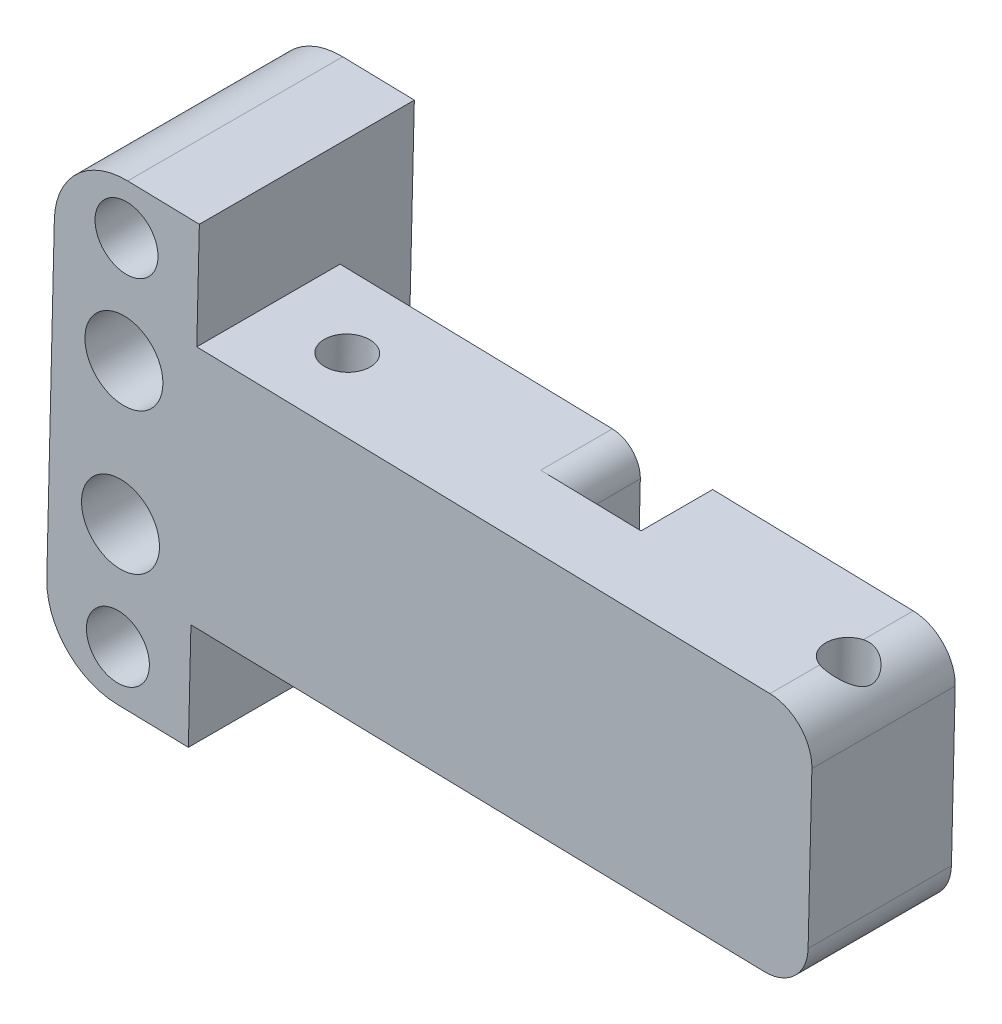
ISO-10303-21;
HEADER;
FILE_DESCRIPTION(('STEP AP214'),'2;1');
FILE_NAME('part.step','',(''),(''),'','','');
FILE_SCHEMA(('AUTOMOTIVE_DESIGN { 1 0 10303 214 1 1 1 1 }'));
ENDSEC;
DATA;
#1=APPLICATION_CONTEXT('core data for automotive mechanical design processes');
#2=APPLICATION_PROTOCOL_DEFINITION('international standard','automotive_design',2000,#1);
#3=PRODUCT_CONTEXT('',#1,'mechanical');
#4=PRODUCT('Part','Part','',(#3));
#5=PRODUCT_RELATED_PRODUCT_CATEGORY('part','',(#4));
#6=PRODUCT_DEFINITION_FORMATION('','',#4);
#7=PRODUCT_DEFINITION_CONTEXT('part definition',#1,'design');
#8=PRODUCT_DEFINITION('design','',#6,#7);
#9=PRODUCT_DEFINITION_SHAPE('','',#8);
#10=(LENGTH_UNIT() NAMED_UNIT(*) SI_UNIT(.MILLI.,.METRE.));
#11=(NAMED_UNIT(*) PLANE_ANGLE_UNIT() SI_UNIT($,.RADIAN.));
#12=(NAMED_UNIT(*) SI_UNIT($,.STERADIAN.) SOLID_ANGLE_UNIT());
#13=UNCERTAINTY_MEASURE_WITH_UNIT(LENGTH_MEASURE(1.E-05),#10,'distance_accuracy_value','');
#14=(GEOMETRIC_REPRESENTATION_CONTEXT(3) GLOBAL_UNCERTAINTY_ASSIGNED_CONTEXT((#13)) GLOBAL_UNIT_ASSIGNED_CONTEXT((#10,
#11,#12)) REPRESENTATION_CONTEXT('',''));
#15=CARTESIAN_POINT('',(0.,0.,0.));
#16=DIRECTION('',(0.,0.,1.));
#17=DIRECTION('',(1.,0.,0.));
#18=AXIS2_PLACEMENT_3D('',#15,#16,#17);
#19=CARTESIAN_POINT('',(0.,0.,-9.99999999999999));
#20=DIRECTION('',(0.,0.,-1.));
#21=DIRECTION('',(-1.,0.,0.));
#22=AXIS2_PLACEMENT_3D('',#19,#20,#21);
#23=PLANE('',#22);
#24=DIRECTION('',(-0.99971315620865,0.0239500585247725,0.));
#25=VECTOR('',#24,1.);
#26=CARTESIAN_POINT('',(22.5449846492901,8.02729576437194,-9.99999999999999));
#27=LINE('',#26,#25);
#28=CARTESIAN_POINT('',(26.5438372741246,7.93149553027285,-9.99999999999999));
#29=VERTEX_POINT('',#28);
#30=CARTESIAN_POINT('',(12.5478530872036,8.26679634961967,-9.99999999999999));
#31=VERTEX_POINT('',#30);
#32=EDGE_CURVE('E181',#29,#31,#27,.T.);
#33=ORIENTED_EDGE('',*,*,#32,.F.);
#34=CARTESIAN_POINT('',(26.4719870985503,4.93235606164691,-9.99999999999999));
#35=DIRECTION('',(0.,0.,-1.));
#36=DIRECTION('',(-1.,0.,0.));
#37=AXIS2_PLACEMENT_3D('',#34,#35,#36);
#38=CIRCLE('',#37,3.);
#39=CARTESIAN_POINT('',(29.4711265671763,4.86050588607259,-9.99999999999999));
#40=VERTEX_POINT('',#39);
#41=EDGE_CURVE('E544',#29,#40,#38,.T.);
#42=ORIENTED_EDGE('',*,*,#41,.T.);
#43=DIRECTION('',(-0.0239500585247709,-0.99971315620865,0.));
#44=VECTOR('',#43,1.);
#45=CARTESIAN_POINT('',(29.8746657660126,21.7048674856626,-9.99999999999999));
#46=LINE('',#45,#44);
#47=CARTESIAN_POINT('',(29.2076759234038,-6.13633883222251,-9.99999999999999));
#48=VERTEX_POINT('',#47);
#49=EDGE_CURVE('E236',#40,#48,#46,.T.);
#50=ORIENTED_EDGE('',*,*,#49,.T.);
#51=CARTESIAN_POINT('',(26.2085364547778,-6.0644886566482,-9.99999999999999));
#52=DIRECTION('',(0.,0.,-1.));
#53=DIRECTION('',(-1.,0.,0.));
#54=AXIS2_PLACEMENT_3D('',#51,#52,#53);
#55=CIRCLE('',#54,3.);
#56=CARTESIAN_POINT('',(26.1366862792035,-9.06362812527415,-9.99999999999999));
#57=VERTEX_POINT('',#56);
#58=EDGE_CURVE('E57',#48,#57,#55,.T.);
#59=ORIENTED_EDGE('',*,*,#58,.T.);
#60=DIRECTION('',(0.99971315620865,-0.0239500585247709,0.));
#61=VECTOR('',#60,1.);
#62=CARTESIAN_POINT('',(-13.8518399691425,-8.10562578428331,-9.99999999999999));
#63=LINE('',#62,#61);
#64=CARTESIAN_POINT('',(12.1407020922824,-8.72832730592735,-9.99999999999999));
#65=VERTEX_POINT('',#64);
#66=EDGE_CURVE('E192',#65,#57,#63,.T.);
#67=ORIENTED_EDGE('',*,*,#66,.F.);
#68=DIRECTION('',(-0.0239500585247725,-0.99971315620865,0.));
#69=VECTOR('',#68,1.);
#70=CARTESIAN_POINT('',(12.3427221080172,-0.295693734753971,-9.99999999999999));
#71=LINE('',#70,#69);
#72=EDGE_CURVE('E197',#31,#65,#71,.T.);
#73=ORIENTED_EDGE('',*,*,#72,.F.);
#74=EDGE_LOOP('',(#33,#42,#50,#59,#67,#73));
#75=FACE_BOUND('',#74,.T.);
#76=ADVANCED_FACE('F41',(#75),#23,.T.);
#77=CARTESIAN_POINT('',(-13.8518399691425,-8.10562578428331,-15.));
#78=DIRECTION('',(-0.0239500585247709,-0.99971315620865,0.));
#79=DIRECTION('',(0.99971315620865,-0.0239500585247709,0.));
#80=AXIS2_PLACEMENT_3D('',#77,#78,#79);
#81=PLANE('',#80);
#82=ORIENTED_EDGE('',*,*,#66,.T.);
#83=DIRECTION('',(0.,0.,1.));
#84=VECTOR('',#83,1.);
#85=CARTESIAN_POINT('',(26.1366862792035,-9.06362812527415,-15.));
#86=LINE('',#85,#84);
#87=CARTESIAN_POINT('',(26.1366862792035,-9.06362812527415,-6.51986841535685));
#88=VERTEX_POINT('',#87);
#89=EDGE_CURVE('E11',#57,#88,#86,.T.);
#90=ORIENTED_EDGE('',*,*,#89,.T.);
#91=CARTESIAN_POINT('',(26.6365428573079,-9.07560315453653,-4.99999999999979));
#92=DIRECTION('',(-0.0239500585247709,-0.99971315620865,0.));
#93=DIRECTION('',(0.99971315620865,-0.0239500585247709,0.));
#94=AXIS2_PLACEMENT_3D('',#91,#92,#93);
#95=CIRCLE('',#94,1.6);
#96=CARTESIAN_POINT('',(26.1366862792035,-9.06362812527415,-3.48013158464272));
#97=VERTEX_POINT('',#96);
#98=EDGE_CURVE('E237',#97,#88,#95,.T.);
#99=ORIENTED_EDGE('',*,*,#98,.F.);
#100=DIRECTION('',(0.,0.,1.));
#101=VECTOR('',#100,1.);
#102=CARTESIAN_POINT('',(26.1366862792035,-9.06362812527415,-15.));
#103=LINE('',#102,#101);
#104=CARTESIAN_POINT('',(26.1366862792035,-9.06362812527415,0.));
#105=VERTEX_POINT('',#104);
#106=EDGE_CURVE('E50',#97,#105,#103,.T.);
#107=ORIENTED_EDGE('',*,*,#106,.T.);
#108=DIRECTION('',(0.99971315620865,-0.0239500585247709,0.));
#109=VECTOR('',#108,1.);
#110=CARTESIAN_POINT('',(-13.8518399691425,-8.10562578428331,0.));
#111=LINE('',#110,#109);
#112=CARTESIAN_POINT('',(-13.8518399691425,-8.10562578428331,0.));
#113=VERTEX_POINT('',#112);
#114=EDGE_CURVE('E551',#113,#105,#111,.T.);
#115=ORIENTED_EDGE('',*,*,#114,.F.);
#116=DIRECTION('',(0.,0.,1.));
#117=VECTOR('',#116,1.);
#118=CARTESIAN_POINT('',(-13.8518399691425,-8.10562578428331,-15.));
#119=LINE('',#118,#117);
#120=CARTESIAN_POINT('',(-13.8518399691425,-8.10562578428331,-10.));
#121=VERTEX_POINT('',#120);
#122=EDGE_CURVE('E212',#121,#113,#119,.T.);
#123=ORIENTED_EDGE('',*,*,#122,.F.);
#124=CARTESIAN_POINT('',(5.14270999882189,-8.56067689625396,-9.99999999999999));
#125=VERTEX_POINT('',#124);
#126=EDGE_CURVE('E588',#121,#125,#63,.T.);
#127=ORIENTED_EDGE('',*,*,#126,.T.);
#128=DIRECTION('',(0.,0.,-1.));
#129=VECTOR('',#128,1.);
#130=CARTESIAN_POINT('',(5.14270999882189,-8.56067689625396,-5.));
#131=LINE('',#130,#129);
#132=CARTESIAN_POINT('',(5.14270999882189,-8.56067689625396,-5.));
#133=VERTEX_POINT('',#132);
#134=EDGE_CURVE('E222',#125,#133,#131,.F.);
#135=ORIENTED_EDGE('',*,*,#134,.T.);
#136=DIRECTION('',(-0.99971315620865,0.0239500585247709,0.));
#137=VECTOR('',#136,1.);
#138=CARTESIAN_POINT('',(-13.8518399691425,-8.10562578428331,-4.99999999999999));
#139=LINE('',#138,#137);
#140=CARTESIAN_POINT('',(12.1407020922824,-8.72832730592735,-5.));
#141=VERTEX_POINT('',#140);
#142=EDGE_CURVE('E580',#141,#133,#139,.T.);
#143=ORIENTED_EDGE('',*,*,#142,.F.);
#144=DIRECTION('',(0.,0.,1.));
#145=VECTOR('',#144,1.);
#146=CARTESIAN_POINT('',(12.1407020922824,-8.72832730592735,-15.));
#147=LINE('',#146,#145);
#148=EDGE_CURVE('E576',#65,#141,#147,.T.);
#149=ORIENTED_EDGE('',*,*,#148,.F.);
#150=EDGE_LOOP('',(#82,#90,#99,#107,#115,#123,#127,#135,#143,#149));
#151=FACE_BOUND('',#150,.T.);
#152=CARTESIAN_POINT('',(-8.35341760999489,-8.23735110616955,-4.99999999999979));
#153=DIRECTION('',(-0.0239500585247709,-0.99971315620865,0.));
#154=DIRECTION('',(0.99971315620865,-0.0239500585247709,0.));
#155=AXIS2_PLACEMENT_3D('',#152,#153,#154);
#156=CIRCLE('',#155,1.6);
#157=CARTESIAN_POINT('',(-6.75387656006104,-8.27567119980918,-4.99999999999979));
#158=VERTEX_POINT('',#157);
#159=EDGE_CURVE('E582',#158,#158,#156,.T.);
#160=ORIENTED_EDGE('',*,*,#159,.F.);
#161=EDGE_LOOP('',(#160));
#162=FACE_BOUND('',#161,.T.);
#163=ADVANCED_FACE('F317',(#151,#162),#81,.T.);
#164=CARTESIAN_POINT('',(22.5449846492901,8.02729576437194,-15.));
#165=DIRECTION('',(0.0239500585247724,0.99971315620865,0.));
#166=DIRECTION('',(-0.99971315620865,0.0239500585247725,0.));
#167=AXIS2_PLACEMENT_3D('',#164,#165,#166);
#168=PLANE('',#167);
#169=DIRECTION('',(-0.99971315620865,0.0239500585247724,0.));
#170=VECTOR('',#169,1.);
#171=CARTESIAN_POINT('',(22.5449846492901,8.02729576437194,0.));
#172=LINE('',#171,#170);
#173=CARTESIAN_POINT('',(26.5438372741246,7.93149553027285,0.));
#174=VERTEX_POINT('',#173);
#175=CARTESIAN_POINT('',(-13.4446889742213,8.88949787126375,0.));
#176=VERTEX_POINT('',#175);
#177=EDGE_CURVE('E613',#174,#176,#172,.T.);
#178=ORIENTED_EDGE('',*,*,#177,.F.);
#179=DIRECTION('',(0.,0.,1.));
#180=VECTOR('',#179,1.);
#181=CARTESIAN_POINT('',(26.5438372741246,7.93149553027285,-15.));
#182=LINE('',#181,#180);
#183=CARTESIAN_POINT('',(26.5438372741246,7.93149553027285,-3.48013158464272));
#184=VERTEX_POINT('',#183);
#185=EDGE_CURVE('E247',#174,#184,#182,.F.);
#186=ORIENTED_EDGE('',*,*,#185,.T.);
#187=CARTESIAN_POINT('',(27.043693852229,7.91952050101047,-4.99999999999979));
#188=DIRECTION('',(0.0239500585247724,0.99971315620865,0.));
#189=DIRECTION('',(-0.99971315620865,0.0239500585247725,0.));
#190=AXIS2_PLACEMENT_3D('',#187,#188,#189);
#191=CIRCLE('',#190,1.6);
#192=CARTESIAN_POINT('',(26.5438372741246,7.93149553027285,-6.51986841535685));
#193=VERTEX_POINT('',#192);
#194=EDGE_CURVE('E233',#193,#184,#191,.T.);
#195=ORIENTED_EDGE('',*,*,#194,.F.);
#196=DIRECTION('',(0.,0.,1.));
#197=VECTOR('',#196,1.);
#198=CARTESIAN_POINT('',(26.5438372741246,7.93149553027285,-15.));
#199=LINE('',#198,#197);
#200=EDGE_CURVE('E189',#193,#29,#199,.F.);
#201=ORIENTED_EDGE('',*,*,#200,.T.);
#202=ORIENTED_EDGE('',*,*,#32,.T.);
#203=DIRECTION('',(0.,0.,-1.));
#204=VECTOR('',#203,1.);
#205=CARTESIAN_POINT('',(12.5478530872036,8.26679634961967,-9.99999999999999));
#206=LINE('',#205,#204);
#207=CARTESIAN_POINT('',(12.5478530872036,8.26679634961967,-5.));
#208=VERTEX_POINT('',#207);
#209=EDGE_CURVE('E186',#208,#31,#206,.T.);
#210=ORIENTED_EDGE('',*,*,#209,.F.);
#211=DIRECTION('',(0.99971315620865,-0.0239500585247725,0.));
#212=VECTOR('',#211,1.);
#213=CARTESIAN_POINT('',(12.5478530872036,8.26679634961967,-5.));
#214=LINE('',#213,#212);
#215=CARTESIAN_POINT('',(5.54986099374301,8.43444675929308,-5.));
#216=VERTEX_POINT('',#215);
#217=EDGE_CURVE('E202',#216,#208,#214,.T.);
#218=ORIENTED_EDGE('',*,*,#217,.F.);
#219=DIRECTION('',(0.,0.,1.));
#220=VECTOR('',#219,1.);
#221=CARTESIAN_POINT('',(5.54986099374301,8.43444675929308,-9.99999999999999));
#222=LINE('',#221,#220);
#223=CARTESIAN_POINT('',(5.54986099374302,8.43444675929308,-9.99999999999999));
#224=VERTEX_POINT('',#223);
#225=EDGE_CURVE('E225',#216,#224,#222,.F.);
#226=ORIENTED_EDGE('',*,*,#225,.T.);
#227=CARTESIAN_POINT('',(-13.4446889742213,8.88949787126375,-10.));
#228=VERTEX_POINT('',#227);
#229=EDGE_CURVE('E193',#224,#228,#27,.T.);
#230=ORIENTED_EDGE('',*,*,#229,.T.);
#231=DIRECTION('',(0.,0.,1.));
#232=VECTOR('',#231,1.);
#233=CARTESIAN_POINT('',(-13.4446889742213,8.88949787126375,-15.));
#234=LINE('',#233,#232);
#235=EDGE_CURVE('E633',#228,#176,#234,.T.);
#236=ORIENTED_EDGE('',*,*,#235,.T.);
#237=EDGE_LOOP('',(#178,#186,#195,#201,#202,#210,#218,#226,#230,#236));
#238=FACE_BOUND('',#237,.T.);
#239=CARTESIAN_POINT('',(-7.94626661507375,8.7577725493775,-4.99999999999979));
#240=DIRECTION('',(0.0239500585247725,0.99971315620865,0.));
#241=DIRECTION('',(-0.99971315620865,0.0239500585247725,0.));
#242=AXIS2_PLACEMENT_3D('',#239,#240,#241);
#243=CIRCLE('',#242,1.6);
#244=CARTESIAN_POINT('',(-9.54580766500759,8.79609264301714,-4.99999999999979));
#245=VERTEX_POINT('',#244);
#246=EDGE_CURVE('E203',#245,#245,#243,.T.);
#247=ORIENTED_EDGE('',*,*,#246,.F.);
#248=EDGE_LOOP('',(#247));
#249=FACE_BOUND('',#248,.T.);
#250=ADVANCED_FACE('F184',(#238,#249),#168,.T.);
#251=CARTESIAN_POINT('',(-14.0314654080783,-15.6034744558481,-15.));
#252=DIRECTION('',(0.99971315620865,-0.0239500585247726,0.));
#253=DIRECTION('',(0.0239500585247726,0.99971315620865,0.));
#254=AXIS2_PLACEMENT_3D('',#251,#252,#253);
#255=PLANE('',#254);
#256=DIRECTION('',(0.0239500585247726,0.99971315620865,0.));
#257=VECTOR('',#256,1.);
#258=CARTESIAN_POINT('',(-14.0314654080783,-15.6034744558481,0.));
#259=LINE('',#258,#257);
#260=CARTESIAN_POINT('',(-14.0314654080783,-15.6034744558481,0.));
#261=VERTEX_POINT('',#260);
#262=EDGE_CURVE('E560',#261,#113,#259,.T.);
#263=ORIENTED_EDGE('',*,*,#262,.F.);
#264=DIRECTION('',(0.,0.,1.));
#265=VECTOR('',#264,1.);
#266=CARTESIAN_POINT('',(-14.0314654080783,-15.6034744558481,-15.));
#267=LINE('',#266,#265);
#268=CARTESIAN_POINT('',(-14.0314654080783,-15.6034744558481,-15.));
#269=VERTEX_POINT('',#268);
#270=EDGE_CURVE('E654',#269,#261,#267,.T.);
#271=ORIENTED_EDGE('',*,*,#270,.F.);
#272=DIRECTION('',(0.023950058524765,0.99971315620865,0.));
#273=VECTOR('',#272,1.);
#274=CARTESIAN_POINT('',(-13.4446889742213,8.88949787126375,-15.));
#275=LINE('',#274,#273);
#276=CARTESIAN_POINT('',(-13.2650635352856,16.3873465428286,-15.));
#277=VERTEX_POINT('',#276);
#278=EDGE_CURVE('E561',#269,#277,#275,.T.);
#279=ORIENTED_EDGE('',*,*,#278,.T.);
#280=DIRECTION('',(0.,0.,1.));
#281=VECTOR('',#280,1.);
#282=CARTESIAN_POINT('',(-13.2650635352856,16.3873465428286,-15.));
#283=LINE('',#282,#281);
#284=CARTESIAN_POINT('',(-13.2650635352856,16.3873465428286,0.));
#285=VERTEX_POINT('',#284);
#286=EDGE_CURVE('E664',#277,#285,#283,.T.);
#287=ORIENTED_EDGE('',*,*,#286,.T.);
#288=DIRECTION('',(0.023950058524765,0.99971315620865,0.));
#289=VECTOR('',#288,1.);
#290=CARTESIAN_POINT('',(-13.4446889742213,8.88949787126375,0.));
#291=LINE('',#290,#289);
#292=EDGE_CURVE('E635',#176,#285,#291,.T.);
#293=ORIENTED_EDGE('',*,*,#292,.F.);
#294=ORIENTED_EDGE('',*,*,#235,.F.);
#295=DIRECTION('',(0.0239500585247746,0.99971315620865,0.));
#296=VECTOR('',#295,1.);
#297=CARTESIAN_POINT('',(-13.4446889742213,8.88949787126375,-10.));
#298=LINE('',#297,#296);
#299=EDGE_CURVE('E585',#121,#228,#298,.T.);
#300=ORIENTED_EDGE('',*,*,#299,.F.);
#301=ORIENTED_EDGE('',*,*,#122,.T.);
#302=EDGE_LOOP('',(#263,#271,#279,#287,#293,#294,#300,#301));
#303=FACE_BOUND('',#302,.T.);
#304=ADVANCED_FACE('F321',(#303),#255,.T.);
#305=CARTESIAN_POINT('',(-19.0300311891215,-15.4837241632243,-15.));
#306=DIRECTION('',(-0.0239500585247688,-0.99971315620865,0.));
#307=DIRECTION('',(0.99971315620865,-0.0239500585247688,0.));
#308=AXIS2_PLACEMENT_3D('',#305,#306,#307);
#309=PLANE('',#308);
#310=DIRECTION('',(0.99971315620865,-0.0239500585247688,0.));
#311=VECTOR('',#310,1.);
#312=CARTESIAN_POINT('',(-19.0300311891215,-15.4837241632243,0.));
#313=LINE('',#312,#311);
#314=CARTESIAN_POINT('',(-19.0300311891215,-15.4837241632243,0.));
#315=VERTEX_POINT('',#314);
#316=EDGE_CURVE('E650',#315,#261,#313,.T.);
#317=ORIENTED_EDGE('',*,*,#316,.F.);
#318=DIRECTION('',(0.,0.,1.));
#319=VECTOR('',#318,1.);
#320=CARTESIAN_POINT('',(-19.0300311891215,-15.4837241632243,-15.));
#321=LINE('',#320,#319);
#322=CARTESIAN_POINT('',(-19.0300311891215,-15.4837241632243,-15.));
#323=VERTEX_POINT('',#322);
#324=EDGE_CURVE('E656',#323,#315,#321,.T.);
#325=ORIENTED_EDGE('',*,*,#324,.F.);
#326=DIRECTION('',(0.99971315620865,-0.0239500585247688,0.));
#327=VECTOR('',#326,1.);
#328=CARTESIAN_POINT('',(-19.0300311891215,-15.4837241632243,-15.));
#329=LINE('',#328,#327);
#330=EDGE_CURVE('E630',#323,#269,#329,.T.);
#331=ORIENTED_EDGE('',*,*,#330,.T.);
#332=ORIENTED_EDGE('',*,*,#270,.T.);
#333=EDGE_LOOP('',(#317,#325,#331,#332));
#334=FACE_BOUND('',#333,.T.);
#335=ADVANCED_FACE('F324',(#334),#309,.T.);
#336=CARTESIAN_POINT('',(-18.9102808964977,-10.4851583821811,-15.));
#337=DIRECTION('',(0.,0.,1.));
#338=DIRECTION('',(1.,0.,0.));
#339=AXIS2_PLACEMENT_3D('',#336,#337,#338);
#340=CYLINDRICAL_SURFACE('',#339,4.99999999999999);
#341=CARTESIAN_POINT('',(-18.9102808964977,-10.4851583821811,0.));
#342=DIRECTION('',(0.,0.,1.));
#343=DIRECTION('',(1.,0.,0.));
#344=AXIS2_PLACEMENT_3D('',#341,#342,#343);
#345=CIRCLE('',#344,4.99999999999999);
#346=CARTESIAN_POINT('',(-23.9088466775409,-10.3654080895572,0.));
#347=VERTEX_POINT('',#346);
#348=EDGE_CURVE('E647',#347,#315,#345,.T.);
#349=ORIENTED_EDGE('',*,*,#348,.F.);
#350=DIRECTION('',(0.,0.,1.));
#351=VECTOR('',#350,1.);
#352=CARTESIAN_POINT('',(-23.9088466775409,-10.3654080895572,-15.));
#353=LINE('',#352,#351);
#354=CARTESIAN_POINT('',(-23.9088466775409,-10.3654080895572,-15.));
#355=VERTEX_POINT('',#354);
#356=EDGE_CURVE('E658',#355,#347,#353,.T.);
#357=ORIENTED_EDGE('',*,*,#356,.F.);
#358=CARTESIAN_POINT('',(-18.9102808964977,-10.4851583821811,-15.));
#359=DIRECTION('',(0.,0.,1.));
#360=DIRECTION('',(1.,0.,0.));
#361=AXIS2_PLACEMENT_3D('',#358,#359,#360);
#362=CIRCLE('',#361,4.99999999999999);
#363=EDGE_CURVE('E627',#355,#323,#362,.T.);
#364=ORIENTED_EDGE('',*,*,#363,.T.);
#365=ORIENTED_EDGE('',*,*,#324,.T.);
#366=EDGE_LOOP('',(#349,#357,#364,#365));
#367=FACE_BOUND('',#366,.T.);
#368=ADVANCED_FACE('F328',(#367),#340,.T.);
#369=CARTESIAN_POINT('',(-23.3819453899959,11.6282813470331,-15.));
#370=DIRECTION('',(-0.99971315620865,0.0239500585247733,0.));
#371=DIRECTION('',(-0.0239500585247733,-0.99971315620865,0.));
#372=AXIS2_PLACEMENT_3D('',#369,#370,#371);
#373=PLANE('',#372);
#374=DIRECTION('',(-0.0239500585247733,-0.99971315620865,0.));
#375=VECTOR('',#374,1.);
#376=CARTESIAN_POINT('',(-23.3819453899959,11.6282813470331,0.));
#377=LINE('',#376,#375);
#378=CARTESIAN_POINT('',(-23.3819453899959,11.6282813470331,0.));
#379=VERTEX_POINT('',#378);
#380=EDGE_CURVE('E644',#379,#347,#377,.T.);
#381=ORIENTED_EDGE('',*,*,#380,.F.);
#382=DIRECTION('',(0.,0.,1.));
#383=VECTOR('',#382,1.);
#384=CARTESIAN_POINT('',(-23.3819453899959,11.6282813470331,-15.));
#385=LINE('',#384,#383);
#386=CARTESIAN_POINT('',(-23.3819453899959,11.6282813470331,-15.));
#387=VERTEX_POINT('',#386);
#388=EDGE_CURVE('E660',#387,#379,#385,.T.);
#389=ORIENTED_EDGE('',*,*,#388,.F.);
#390=DIRECTION('',(-0.0239500585247733,-0.99971315620865,0.));
#391=VECTOR('',#390,1.);
#392=CARTESIAN_POINT('',(-23.3819453899959,11.6282813470331,-15.));
#393=LINE('',#392,#391);
#394=EDGE_CURVE('E624',#387,#355,#393,.T.);
#395=ORIENTED_EDGE('',*,*,#394,.T.);
#396=ORIENTED_EDGE('',*,*,#356,.T.);
#397=EDGE_LOOP('',(#381,#389,#395,#396));
#398=FACE_BOUND('',#397,.T.);
#399=ADVANCED_FACE('F332',(#398),#373,.T.);
#400=CARTESIAN_POINT('',(-18.3833796089526,11.5085310544092,-15.));
#401=DIRECTION('',(0.,0.,1.));
#402=DIRECTION('',(1.,0.,0.));
#403=AXIS2_PLACEMENT_3D('',#400,#401,#402);
#404=CYLINDRICAL_SURFACE('',#403,4.99999999999999);
#405=CARTESIAN_POINT('',(-18.3833796089526,11.5085310544092,0.));
#406=DIRECTION('',(0.,0.,1.));
#407=DIRECTION('',(1.,0.,0.));
#408=AXIS2_PLACEMENT_3D('',#405,#406,#407);
#409=CIRCLE('',#408,4.99999999999999);
#410=CARTESIAN_POINT('',(-18.2636293163288,16.5070968354525,0.));
#411=VERTEX_POINT('',#410);
#412=EDGE_CURVE('E641',#411,#379,#409,.T.);
#413=ORIENTED_EDGE('',*,*,#412,.F.);
#414=DIRECTION('',(0.,0.,1.));
#415=VECTOR('',#414,1.);
#416=CARTESIAN_POINT('',(-18.2636293163288,16.5070968354525,-15.));
#417=LINE('',#416,#415);
#418=CARTESIAN_POINT('',(-18.2636293163288,16.5070968354525,-15.));
#419=VERTEX_POINT('',#418);
#420=EDGE_CURVE('E662',#419,#411,#417,.T.);
#421=ORIENTED_EDGE('',*,*,#420,.F.);
#422=CARTESIAN_POINT('',(-18.3833796089526,11.5085310544092,-15.));
#423=DIRECTION('',(0.,0.,1.));
#424=DIRECTION('',(1.,0.,0.));
#425=AXIS2_PLACEMENT_3D('',#422,#423,#424);
#426=CIRCLE('',#425,4.99999999999999);
#427=EDGE_CURVE('E621',#419,#387,#426,.T.);
#428=ORIENTED_EDGE('',*,*,#427,.T.);
#429=ORIENTED_EDGE('',*,*,#388,.T.);
#430=EDGE_LOOP('',(#413,#421,#428,#429));
#431=FACE_BOUND('',#430,.T.);
#432=ADVANCED_FACE('F336',(#431),#404,.T.);
#433=CARTESIAN_POINT('',(-13.2650635352856,16.3873465428286,-15.));
#434=DIRECTION('',(0.0239500585247688,0.99971315620865,0.));
#435=DIRECTION('',(-0.99971315620865,0.0239500585247688,0.));
#436=AXIS2_PLACEMENT_3D('',#433,#434,#435);
#437=PLANE('',#436);
#438=DIRECTION('',(-0.99971315620865,0.0239500585247688,0.));
#439=VECTOR('',#438,1.);
#440=CARTESIAN_POINT('',(-13.2650635352856,16.3873465428286,0.));
#441=LINE('',#440,#439);
#442=EDGE_CURVE('E638',#285,#411,#441,.T.);
#443=ORIENTED_EDGE('',*,*,#442,.F.);
#444=ORIENTED_EDGE('',*,*,#286,.F.);
#445=DIRECTION('',(-0.99971315620865,0.0239500585247688,0.));
#446=VECTOR('',#445,1.);
#447=CARTESIAN_POINT('',(-13.2650635352856,16.3873465428286,-15.));
#448=LINE('',#447,#446);
#449=EDGE_CURVE('E618',#277,#419,#448,.T.);
#450=ORIENTED_EDGE('',*,*,#449,.T.);
#451=ORIENTED_EDGE('',*,*,#420,.T.);
#452=EDGE_LOOP('',(#443,#444,#450,#451));
#453=FACE_BOUND('',#452,.T.);
#454=ADVANCED_FACE('F312',(#453),#437,.T.);
#455=CARTESIAN_POINT('',(22.1857337714185,-6.96840157875778,-15.));
#456=DIRECTION('',(0.,0.,1.));
#457=DIRECTION('',(1.,0.,0.));
#458=AXIS2_PLACEMENT_3D('',#455,#456,#457);
#459=PLANE('',#458);
#460=CARTESIAN_POINT('',(-18.3474545211655,13.0081007887222,-15.));
#461=DIRECTION('',(0.,0.,1.));
#462=DIRECTION('',(1.,0.,0.));
#463=AXIS2_PLACEMENT_3D('',#460,#461,#462);
#464=CIRCLE('',#463,2.19638865502019);
#465=CARTESIAN_POINT('',(-16.1510658661453,13.0081007887222,-15.));
#466=VERTEX_POINT('',#465);
#467=EDGE_CURVE('E592',#466,#466,#464,.T.);
#468=ORIENTED_EDGE('',*,*,#467,.T.);
#469=EDGE_LOOP('',(#468));
#470=FACE_BOUND('',#469,.T.);
#471=CARTESIAN_POINT('',(-18.5270799601013,5.51025211715733,-15.));
#472=DIRECTION('',(0.,0.,1.));
#473=DIRECTION('',(1.,0.,0.));
#474=AXIS2_PLACEMENT_3D('',#471,#472,#473);
#475=CIRCLE('',#474,2.72007986301725);
#476=CARTESIAN_POINT('',(-15.807000097084,5.51025211715733,-15.));
#477=VERTEX_POINT('',#476);
#478=EDGE_CURVE('E598',#477,#477,#475,.T.);
#479=ORIENTED_EDGE('',*,*,#478,.T.);
#480=EDGE_LOOP('',(#479));
#481=FACE_BOUND('',#480,.T.);
#482=CARTESIAN_POINT('',(-18.766580545349,-4.48687944492915,-15.));
#483=DIRECTION('',(0.,0.,1.));
#484=DIRECTION('',(1.,0.,0.));
#485=AXIS2_PLACEMENT_3D('',#482,#483,#484);
#486=CIRCLE('',#485,2.72007986301725);
#487=CARTESIAN_POINT('',(-16.0465006823318,-4.48687944492915,-15.));
#488=VERTEX_POINT('',#487);
#489=EDGE_CURVE('E604',#488,#488,#486,.T.);
#490=ORIENTED_EDGE('',*,*,#489,.T.);
#491=EDGE_LOOP('',(#490));
#492=FACE_BOUND('',#491,.T.);
#493=CARTESIAN_POINT('',(-18.9462059842848,-11.984728116494,-15.));
#494=DIRECTION('',(0.,0.,1.));
#495=DIRECTION('',(1.,0.,0.));
#496=AXIS2_PLACEMENT_3D('',#493,#494,#495);
#497=CIRCLE('',#496,2.19638865502019);
#498=CARTESIAN_POINT('',(-16.7498173292646,-11.984728116494,-15.));
#499=VERTEX_POINT('',#498);
#500=EDGE_CURVE('E610',#499,#499,#497,.T.);
#501=ORIENTED_EDGE('',*,*,#500,.T.);
#502=EDGE_LOOP('',(#501));
#503=FACE_BOUND('',#502,.T.);
#504=ORIENTED_EDGE('',*,*,#278,.F.);
#505=ORIENTED_EDGE('',*,*,#330,.F.);
#506=ORIENTED_EDGE('',*,*,#363,.F.);
#507=ORIENTED_EDGE('',*,*,#394,.F.);
#508=ORIENTED_EDGE('',*,*,#427,.F.);
#509=ORIENTED_EDGE('',*,*,#449,.F.);
#510=EDGE_LOOP('',(#504,#505,#506,#507,#508,#509));
#511=FACE_BOUND('',#510,.T.);
#512=ADVANCED_FACE('F309',(#470,#481,#492,#503,#511),#459,.F.);
#513=CARTESIAN_POINT('',(22.1857337714185,-6.96840157875778,0.));
#514=DIRECTION('',(0.,0.,1.));
#515=DIRECTION('',(1.,0.,0.));
#516=AXIS2_PLACEMENT_3D('',#513,#514,#515);
#517=PLANE('',#516);
#518=DIRECTION('',(-0.0239500585247709,-0.99971315620865,0.));
#519=VECTOR('',#518,1.);
#520=CARTESIAN_POINT('',(29.8746657660126,21.7048674856626,0.));
#521=LINE('',#520,#519);
#522=CARTESIAN_POINT('',(29.4711265671763,4.86050588607259,0.));
#523=VERTEX_POINT('',#522);
#524=CARTESIAN_POINT('',(29.2076759234038,-6.13633883222251,0.));
#525=VERTEX_POINT('',#524);
#526=EDGE_CURVE('E566',#523,#525,#521,.T.);
#527=ORIENTED_EDGE('',*,*,#526,.F.);
#528=CARTESIAN_POINT('',(26.4719870985503,4.93235606164691,0.));
#529=DIRECTION('',(0.,0.,1.));
#530=DIRECTION('',(1.,0.,0.));
#531=AXIS2_PLACEMENT_3D('',#528,#529,#530);
#532=CIRCLE('',#531,3.);
#533=EDGE_CURVE('E244',#523,#174,#532,.T.);
#534=ORIENTED_EDGE('',*,*,#533,.T.);
#535=ORIENTED_EDGE('',*,*,#177,.T.);
#536=ORIENTED_EDGE('',*,*,#292,.T.);
#537=ORIENTED_EDGE('',*,*,#442,.T.);
#538=ORIENTED_EDGE('',*,*,#412,.T.);
#539=ORIENTED_EDGE('',*,*,#380,.T.);
#540=ORIENTED_EDGE('',*,*,#348,.T.);
#541=ORIENTED_EDGE('',*,*,#316,.T.);
#542=ORIENTED_EDGE('',*,*,#262,.T.);
#543=ORIENTED_EDGE('',*,*,#114,.T.);
#544=CARTESIAN_POINT('',(26.2085364547778,-6.0644886566482,0.));
#545=DIRECTION('',(0.,0.,1.));
#546=DIRECTION('',(1.,0.,0.));
#547=AXIS2_PLACEMENT_3D('',#544,#545,#546);
#548=CIRCLE('',#547,3.);
#549=EDGE_CURVE('E242',#105,#525,#548,.T.);
#550=ORIENTED_EDGE('',*,*,#549,.T.);
#551=EDGE_LOOP('',(#527,#534,#535,#536,#537,#538,#539,#540,#541,#542,#543,#550));
#552=FACE_BOUND('',#551,.T.);
#553=CARTESIAN_POINT('',(-18.3474545211655,13.0081007887222,0.));
#554=DIRECTION('',(0.,0.,1.));
#555=DIRECTION('',(1.,0.,0.));
#556=AXIS2_PLACEMENT_3D('',#553,#554,#555);
#557=CIRCLE('',#556,2.19638865502019);
#558=CARTESIAN_POINT('',(-16.1510658661453,13.0081007887222,0.));
#559=VERTEX_POINT('',#558);
#560=EDGE_CURVE('E591',#559,#559,#557,.T.);
#561=ORIENTED_EDGE('',*,*,#560,.F.);
#562=EDGE_LOOP('',(#561));
#563=FACE_BOUND('',#562,.T.);
#564=CARTESIAN_POINT('',(-18.5270799601013,5.51025211715733,0.));
#565=DIRECTION('',(0.,0.,1.));
#566=DIRECTION('',(1.,0.,0.));
#567=AXIS2_PLACEMENT_3D('',#564,#565,#566);
#568=CIRCLE('',#567,2.72007986301725);
#569=CARTESIAN_POINT('',(-15.807000097084,5.51025211715733,0.));
#570=VERTEX_POINT('',#569);
#571=EDGE_CURVE('E595',#570,#570,#568,.T.);
#572=ORIENTED_EDGE('',*,*,#571,.F.);
#573=EDGE_LOOP('',(#572));
#574=FACE_BOUND('',#573,.T.);
#575=CARTESIAN_POINT('',(-18.766580545349,-4.48687944492915,0.));
#576=DIRECTION('',(0.,0.,1.));
#577=DIRECTION('',(1.,0.,0.));
#578=AXIS2_PLACEMENT_3D('',#575,#576,#577);
#579=CIRCLE('',#578,2.72007986301725);
#580=CARTESIAN_POINT('',(-16.0465006823318,-4.48687944492915,0.));
#581=VERTEX_POINT('',#580);
#582=EDGE_CURVE('E601',#581,#581,#579,.T.);
#583=ORIENTED_EDGE('',*,*,#582,.F.);
#584=EDGE_LOOP('',(#583));
#585=FACE_BOUND('',#584,.T.);
#586=CARTESIAN_POINT('',(-18.9462059842848,-11.984728116494,0.));
#587=DIRECTION('',(0.,0.,1.));
#588=DIRECTION('',(1.,0.,0.));
#589=AXIS2_PLACEMENT_3D('',#586,#587,#588);
#590=CIRCLE('',#589,2.19638865502019);
#591=CARTESIAN_POINT('',(-16.7498173292646,-11.984728116494,0.));
#592=VERTEX_POINT('',#591);
#593=EDGE_CURVE('E607',#592,#592,#590,.T.);
#594=ORIENTED_EDGE('',*,*,#593,.F.);
#595=EDGE_LOOP('',(#594));
#596=FACE_BOUND('',#595,.T.);
#597=ADVANCED_FACE('F307',(#552,#563,#574,#585,#596),#517,.T.);
#598=CARTESIAN_POINT('',(-18.9462059842848,-11.984728116494,-15.));
#599=DIRECTION('',(0.,0.,1.));
#600=DIRECTION('',(1.,0.,0.));
#601=AXIS2_PLACEMENT_3D('',#598,#599,#600);
#602=CYLINDRICAL_SURFACE('',#601,2.19638865502019);
#603=ORIENTED_EDGE('',*,*,#593,.T.);
#604=EDGE_LOOP('',(#603));
#605=FACE_BOUND('',#604,.T.);
#606=ORIENTED_EDGE('',*,*,#500,.F.);
#607=EDGE_LOOP('',(#606));
#608=FACE_BOUND('',#607,.T.);
#609=ADVANCED_FACE('F303',(#605,#608),#602,.F.);
#610=CARTESIAN_POINT('',(-18.766580545349,-4.48687944492915,-15.));
#611=DIRECTION('',(0.,0.,1.));
#612=DIRECTION('',(1.,0.,0.));
#613=AXIS2_PLACEMENT_3D('',#610,#611,#612);
#614=CYLINDRICAL_SURFACE('',#613,2.72007986301725);
#615=ORIENTED_EDGE('',*,*,#582,.T.);
#616=EDGE_LOOP('',(#615));
#617=FACE_BOUND('',#616,.T.);
#618=ORIENTED_EDGE('',*,*,#489,.F.);
#619=EDGE_LOOP('',(#618));
#620=FACE_BOUND('',#619,.T.);
#621=ADVANCED_FACE('F299',(#617,#620),#614,.F.);
#622=CARTESIAN_POINT('',(-18.5270799601013,5.51025211715733,-15.));
#623=DIRECTION('',(0.,0.,1.));
#624=DIRECTION('',(1.,0.,0.));
#625=AXIS2_PLACEMENT_3D('',#622,#623,#624);
#626=CYLINDRICAL_SURFACE('',#625,2.72007986301725);
#627=ORIENTED_EDGE('',*,*,#571,.T.);
#628=EDGE_LOOP('',(#627));
#629=FACE_BOUND('',#628,.T.);
#630=ORIENTED_EDGE('',*,*,#478,.F.);
#631=EDGE_LOOP('',(#630));
#632=FACE_BOUND('',#631,.T.);
#633=ADVANCED_FACE('F295',(#629,#632),#626,.F.);
#634=CARTESIAN_POINT('',(-18.3474545211655,13.0081007887222,-15.));
#635=DIRECTION('',(0.,0.,1.));
#636=DIRECTION('',(1.,0.,0.));
#637=AXIS2_PLACEMENT_3D('',#634,#635,#636);
#638=CYLINDRICAL_SURFACE('',#637,2.19638865502019);
#639=ORIENTED_EDGE('',*,*,#560,.T.);
#640=EDGE_LOOP('',(#639));
#641=FACE_BOUND('',#640,.T.);
#642=ORIENTED_EDGE('',*,*,#467,.F.);
#643=EDGE_LOOP('',(#642));
#644=FACE_BOUND('',#643,.T.);
#645=ADVANCED_FACE('F291',(#641,#644),#638,.F.);
#646=DIRECTION('',(0.0239500585247725,0.99971315620865,0.));
#647=VECTOR('',#646,1.);
#648=CARTESIAN_POINT('',(7.34415632697399,-0.175943442130109,-9.99999999999999));
#649=LINE('',#648,#647);
#650=CARTESIAN_POINT('',(7.19003642828873,-6.6091507008862,-9.99999999999999));
#651=VERTEX_POINT('',#650);
#652=CARTESIAN_POINT('',(7.50138718911077,6.38712032982623,-9.99999999999999));
#653=VERTEX_POINT('',#652);
#654=EDGE_CURVE('E206',#651,#653,#649,.T.);
#655=ORIENTED_EDGE('',*,*,#654,.F.);
#656=CARTESIAN_POINT('',(5.19061011587143,-6.56125058383666,-9.99999999999999));
#657=DIRECTION('',(0.,0.,-1.));
#658=DIRECTION('',(-1.,0.,0.));
#659=AXIS2_PLACEMENT_3D('',#656,#657,#658);
#660=CIRCLE('',#659,2.);
#661=EDGE_CURVE('E220',#651,#125,#660,.T.);
#662=ORIENTED_EDGE('',*,*,#661,.T.);
#663=ORIENTED_EDGE('',*,*,#126,.F.);
#664=ORIENTED_EDGE('',*,*,#299,.T.);
#665=ORIENTED_EDGE('',*,*,#229,.F.);
#666=CARTESIAN_POINT('',(5.50196087669347,6.43502044687578,-9.99999999999999));
#667=DIRECTION('',(0.,0.,-1.));
#668=DIRECTION('',(-1.,0.,0.));
#669=AXIS2_PLACEMENT_3D('',#666,#667,#668);
#670=CIRCLE('',#669,2.);
#671=EDGE_CURVE('E218',#224,#653,#670,.T.);
#672=ORIENTED_EDGE('',*,*,#671,.T.);
#673=EDGE_LOOP('',(#655,#662,#663,#664,#665,#672));
#674=FACE_BOUND('',#673,.T.);
#675=ADVANCED_FACE('F288',(#674),#23,.T.);
#676=CARTESIAN_POINT('',(12.0209517996586,-13.7268930869706,-9.99999999999999));
#677=DIRECTION('',(0.99971315620865,-0.0239500585247725,0.));
#678=DIRECTION('',(0.0239500585247725,0.99971315620865,0.));
#679=AXIS2_PLACEMENT_3D('',#676,#677,#678);
#680=PLANE('',#679);
#681=ORIENTED_EDGE('',*,*,#148,.T.);
#682=DIRECTION('',(0.0239500585247725,0.99971315620865,0.));
#683=VECTOR('',#682,1.);
#684=CARTESIAN_POINT('',(12.0209517996586,-13.7268930869706,-5.));
#685=LINE('',#684,#683);
#686=EDGE_CURVE('E200',#141,#208,#685,.T.);
#687=ORIENTED_EDGE('',*,*,#686,.T.);
#688=ORIENTED_EDGE('',*,*,#209,.T.);
#689=ORIENTED_EDGE('',*,*,#72,.T.);
#690=EDGE_LOOP('',(#681,#687,#688,#689));
#691=FACE_BOUND('',#690,.T.);
#692=ADVANCED_FACE('F196',(#691),#680,.F.);
#693=CARTESIAN_POINT('',(12.0209517996586,-13.7268930869706,-5.));
#694=DIRECTION('',(0.,0.,1.));
#695=DIRECTION('',(1.,0.,0.));
#696=AXIS2_PLACEMENT_3D('',#693,#694,#695);
#697=PLANE('',#696);
#698=ORIENTED_EDGE('',*,*,#142,.T.);
#699=CARTESIAN_POINT('',(5.19061011587143,-6.56125058383666,-5.));
#700=DIRECTION('',(0.,0.,1.));
#701=DIRECTION('',(1.,0.,0.));
#702=AXIS2_PLACEMENT_3D('',#699,#700,#701);
#703=CIRCLE('',#702,2.);
#704=CARTESIAN_POINT('',(7.19003642828873,-6.6091507008862,-5.));
#705=VERTEX_POINT('',#704);
#706=EDGE_CURVE('E227',#133,#705,#703,.T.);
#707=ORIENTED_EDGE('',*,*,#706,.T.);
#708=DIRECTION('',(0.0239500585247725,0.99971315620865,0.));
#709=VECTOR('',#708,1.);
#710=CARTESIAN_POINT('',(7.02238601861532,-13.6071427943468,-5.));
#711=LINE('',#710,#709);
#712=CARTESIAN_POINT('',(7.50138718911077,6.38712032982624,-5.));
#713=VERTEX_POINT('',#712);
#714=EDGE_CURVE('E574',#705,#713,#711,.T.);
#715=ORIENTED_EDGE('',*,*,#714,.T.);
#716=CARTESIAN_POINT('',(5.50196087669347,6.43502044687578,-5.));
#717=DIRECTION('',(0.,0.,1.));
#718=DIRECTION('',(1.,0.,0.));
#719=AXIS2_PLACEMENT_3D('',#716,#717,#718);
#720=CIRCLE('',#719,2.);
#721=EDGE_CURVE('E229',#713,#216,#720,.T.);
#722=ORIENTED_EDGE('',*,*,#721,.T.);
#723=ORIENTED_EDGE('',*,*,#217,.T.);
#724=ORIENTED_EDGE('',*,*,#686,.F.);
#725=EDGE_LOOP('',(#698,#707,#715,#722,#723,#724));
#726=FACE_BOUND('',#725,.T.);
#727=ADVANCED_FACE('F279',(#726),#697,.F.);
#728=CARTESIAN_POINT('',(7.02238601861532,-13.6071427943468,-9.99999999999999));
#729=DIRECTION('',(-0.99971315620865,0.0239500585247725,0.));
#730=DIRECTION('',(-0.0239500585247725,-0.99971315620865,0.));
#731=AXIS2_PLACEMENT_3D('',#728,#729,#730);
#732=PLANE('',#731);
#733=ORIENTED_EDGE('',*,*,#714,.F.);
#734=DIRECTION('',(0.,0.,-1.));
#735=VECTOR('',#734,1.);
#736=CARTESIAN_POINT('',(7.19003642828873,-6.6091507008862,-9.99999999999999));
#737=LINE('',#736,#735);
#738=EDGE_CURVE('E209',#705,#651,#737,.T.);
#739=ORIENTED_EDGE('',*,*,#738,.T.);
#740=ORIENTED_EDGE('',*,*,#654,.T.);
#741=DIRECTION('',(0.,0.,1.));
#742=VECTOR('',#741,1.);
#743=CARTESIAN_POINT('',(7.50138718911077,6.38712032982623,-5.));
#744=LINE('',#743,#742);
#745=EDGE_CURVE('E205',#653,#713,#744,.T.);
#746=ORIENTED_EDGE('',*,*,#745,.T.);
#747=EDGE_LOOP('',(#733,#739,#740,#746));
#748=FACE_BOUND('',#747,.T.);
#749=ADVANCED_FACE('F277',(#748),#732,.F.);
#750=CARTESIAN_POINT('',(-8.47316790261875,-13.2359168872128,-4.99999999999979));
#751=DIRECTION('',(0.0239500585247725,0.99971315620865,0.));
#752=DIRECTION('',(-0.99971315620865,0.0239500585247725,0.));
#753=AXIS2_PLACEMENT_3D('',#750,#751,#752);
#754=CYLINDRICAL_SURFACE('',#753,1.6);
#755=ORIENTED_EDGE('',*,*,#159,.T.);
#756=EDGE_LOOP('',(#755));
#757=FACE_BOUND('',#756,.T.);
#758=ORIENTED_EDGE('',*,*,#246,.T.);
#759=EDGE_LOOP('',(#758));
#760=FACE_BOUND('',#759,.T.);
#761=ADVANCED_FACE('F273',(#757,#760),#754,.F.);
#762=CARTESIAN_POINT('',(5.19061011587143,-6.56125058383666,-9.99999999999999));
#763=DIRECTION('',(0.,0.,1.));
#764=DIRECTION('',(1.,0.,0.));
#765=AXIS2_PLACEMENT_3D('',#762,#763,#764);
#766=CYLINDRICAL_SURFACE('',#765,2.);
#767=ORIENTED_EDGE('',*,*,#706,.F.);
#768=ORIENTED_EDGE('',*,*,#134,.F.);
#769=ORIENTED_EDGE('',*,*,#661,.F.);
#770=ORIENTED_EDGE('',*,*,#738,.F.);
#771=EDGE_LOOP('',(#767,#768,#769,#770));
#772=FACE_BOUND('',#771,.T.);
#773=ADVANCED_FACE('F276',(#772),#766,.T.);
#774=CARTESIAN_POINT('',(5.50196087669347,6.43502044687578,-9.99999999999999));
#775=DIRECTION('',(0.,0.,-1.));
#776=DIRECTION('',(-1.,0.,0.));
#777=AXIS2_PLACEMENT_3D('',#774,#775,#776);
#778=CYLINDRICAL_SURFACE('',#777,2.);
#779=ORIENTED_EDGE('',*,*,#671,.F.);
#780=ORIENTED_EDGE('',*,*,#225,.F.);
#781=ORIENTED_EDGE('',*,*,#721,.F.);
#782=ORIENTED_EDGE('',*,*,#745,.F.);
#783=EDGE_LOOP('',(#779,#780,#781,#782));
#784=FACE_BOUND('',#783,.T.);
#785=ADVANCED_FACE('F271',(#784),#778,.T.);
#786=CARTESIAN_POINT('',(29.8746657660126,21.7048674856626,0.));
#787=DIRECTION('',(0.99971315620865,-0.0239500585247709,0.));
#788=DIRECTION('',(0.0239500585247709,0.99971315620865,0.));
#789=AXIS2_PLACEMENT_3D('',#786,#787,#788);
#790=PLANE('',#789);
#791=ORIENTED_EDGE('',*,*,#49,.F.);
#792=DIRECTION('',(0.,0.,1.));
#793=VECTOR('',#792,1.);
#794=CARTESIAN_POINT('',(29.4711265671763,4.8605058860726,0.));
#795=LINE('',#794,#793);
#796=EDGE_CURVE('E239',#40,#523,#795,.T.);
#797=ORIENTED_EDGE('',*,*,#796,.T.);
#798=ORIENTED_EDGE('',*,*,#526,.T.);
#799=DIRECTION('',(0.,0.,1.));
#800=VECTOR('',#799,1.);
#801=CARTESIAN_POINT('',(29.2076759234038,-6.13633883222251,0.));
#802=LINE('',#801,#800);
#803=EDGE_CURVE('E232',#525,#48,#802,.F.);
#804=ORIENTED_EDGE('',*,*,#803,.T.);
#805=EDGE_LOOP('',(#791,#797,#798,#804));
#806=FACE_BOUND('',#805,.T.);
#807=ADVANCED_FACE('F266',(#806),#790,.T.);
#808=CARTESIAN_POINT('',(27.0676439107537,8.91923365721916,-4.99999999999979));
#809=DIRECTION('',(-0.0239500585247709,-0.99971315620865,0.));
#810=DIRECTION('',(0.99971315620865,-0.0239500585247709,0.));
#811=AXIS2_PLACEMENT_3D('',#808,#809,#810);
#812=CYLINDRICAL_SURFACE('',#811,1.6);
#813=ORIENTED_EDGE('',*,*,#194,.T.);
#814=CARTESIAN_POINT('',(26.5438372741246,7.93149553027285,-3.48013158464272));
#815=CARTESIAN_POINT('',(26.582635658852,7.93056917504739,-3.46736230339755));
#816=CARTESIAN_POINT('',(26.6218898763352,7.92887125096481,-3.45608963630595));
#817=CARTESIAN_POINT('',(26.701041803988,7.92386151581038,-3.43658983377933));
#818=CARTESIAN_POINT('',(26.7409394491167,7.9205498668853,-3.4283623925067));
#819=CARTESIAN_POINT('',(26.8608236516707,7.90812747425929,-3.40838685289725));
#820=CARTESIAN_POINT('',(26.9413777254763,7.89652170207705,-3.40122254021957));
#821=CARTESIAN_POINT('',(27.1013726373639,7.86672336961588,-3.39906382011281));
#822=CARTESIAN_POINT('',(27.1808132657095,7.84852958524309,-3.40407167533711));
#823=CARTESIAN_POINT('',(27.3365243466196,7.80621946098797,-3.42552846124759));
#824=CARTESIAN_POINT('',(27.4127929071167,7.78209964396104,-3.44198411943893));
#825=CARTESIAN_POINT('',(27.5631475672157,7.72806386126594,-3.48606547215657));
#826=CARTESIAN_POINT('',(27.6370573330167,7.69797106552841,-3.51407055535882));
#827=CARTESIAN_POINT('',(27.7785244485489,7.63402154765614,-3.5799846023409));
#828=CARTESIAN_POINT('',(27.8460798246198,7.60016366317156,-3.61789662947375));
#829=CARTESIAN_POINT('',(27.9833310701681,7.5251913193761,-3.70864240019354));
#830=CARTESIAN_POINT('',(28.0519390449683,7.48373331470815,-3.76283763604525));
#831=CARTESIAN_POINT('',(28.1792848494636,7.40034026999605,-3.88173413124096));
#832=CARTESIAN_POINT('',(28.238002051437,7.3584044230672,-3.94645680714063));
#833=CARTESIAN_POINT('',(28.3511088918131,7.27212755599753,-4.09408593228806));
#834=CARTESIAN_POINT('',(28.4041259759935,7.22810500406673,-4.17824352562695));
#835=CARTESIAN_POINT('',(28.4947025602692,7.14871605943139,-4.35811369652854));
#836=CARTESIAN_POINT('',(28.5323171440196,7.11331900679855,-4.45378348587329));
#837=CARTESIAN_POINT('',(28.5786232499702,7.06840618918645,-4.61704289193334));
#838=CARTESIAN_POINT('',(28.5928705370442,7.05416195893817,-4.68175712518923));
#839=CARTESIAN_POINT('',(28.6134244039747,7.03341907725362,-4.81361251813582));
#840=CARTESIAN_POINT('',(28.6197433904836,7.02690832488778,-4.88074971641121));
#841=CARTESIAN_POINT('',(28.6240153607707,7.02252037262194,-5.01578746539748));
#842=CARTESIAN_POINT('',(28.6219430227189,7.02466930426509,-5.08368970906652));
#843=CARTESIAN_POINT('',(28.6095372482154,7.03733857385595,-5.2179593874968));
#844=CARTESIAN_POINT('',(28.5991954815869,7.04786735316108,-5.28432520514602));
#845=CARTESIAN_POINT('',(28.5681349109889,7.07868417737929,-5.42652740689584));
#846=CARTESIAN_POINT('',(28.5457800046774,7.10048011257332,-5.50167184052906));
#847=CARTESIAN_POINT('',(28.4915674528898,7.15106404896241,-5.64594711272023));
#848=CARTESIAN_POINT('',(28.4596911563771,7.17986575270188,-5.71506580120764));
#849=CARTESIAN_POINT('',(28.3770493109103,7.25064916315743,-5.86585095540014));
#850=CARTESIAN_POINT('',(28.3234864081514,7.29402834530211,-5.94532392290719));
#851=CARTESIAN_POINT('',(28.2038400534592,7.38312459090473,-6.09271056202957));
#852=CARTESIAN_POINT('',(28.1377443574798,7.42884390842467,-6.16061280528901));
#853=CARTESIAN_POINT('',(27.9932388654306,7.51946676711065,-6.28448256300535));
#854=CARTESIAN_POINT('',(27.9147138535006,7.56435778484866,-6.34032552874638));
#855=CARTESIAN_POINT('',(27.7469561760254,7.64957199068887,-6.43739074068786));
#856=CARTESIAN_POINT('',(27.6577425200101,7.68990304732429,-6.47863844238942));
#857=CARTESIAN_POINT('',(27.4885241164145,7.75605209727784,-6.53794335102696));
#858=CARTESIAN_POINT('',(27.4100528142822,7.78316932800915,-6.55893631190809));
#859=CARTESIAN_POINT('',(27.2489713887487,7.83120396390218,-6.58864057978885));
#860=CARTESIAN_POINT('',(27.1663657434318,7.8521279143528,-6.59736488960882));
#861=CARTESIAN_POINT('',(27.0380551948571,7.8788261340197,-6.60063186057997));
#862=CARTESIAN_POINT('',(26.9929413807189,7.88713266234621,-6.59986546345896));
#863=CARTESIAN_POINT('',(26.9025901134564,7.9016438351343,-6.59445334555142));
#864=CARTESIAN_POINT('',(26.8573526491079,7.9078482819305,-6.58980726008772));
#865=CARTESIAN_POINT('',(26.7669148817674,7.91817250920852,-6.57656786907647));
#866=CARTESIAN_POINT('',(26.7217167685458,7.9222783498184,-6.56794887425791));
#867=CARTESIAN_POINT('',(26.6320888765586,7.92842059199876,-6.54681539322222));
#868=CARTESIAN_POINT('',(26.5876592309025,7.93045663851097,-6.53430023912786));
#869=CARTESIAN_POINT('',(26.5438372741246,7.93149553027286,-6.51986841535685));
#870=B_SPLINE_CURVE_WITH_KNOTS('',3,(#814,#815,#816,#817,#818,#819,#820,#821,#822,#823,#824,
#825,#826,#827,#828,#829,#830,#831,#832,#833,#834,#835,#836,#837,#838,#839,#840,#841,#842,#843,
#844,#845,#846,#847,#848,#849,#850,#851,#852,#853,#854,#855,#856,#857,#858,#859,#860,#861,#862,
#863,#864,#865,#866,#867,#868,#869),.UNSPECIFIED.,.F.,.F.,(4,2,2,2,2,2,2,2,2,2,2,2,2,2,2,2,2,2,
2,2,2,2,2,2,2,2,2,4),(0.,0.122495627990484,0.244978950180576,0.488773702180551,
0.732613776033663,0.976597268028635,1.22932981645865,1.48214060566893,1.77128741698978,
2.06102998688157,2.38566292180326,2.70912451971535,2.91164525740489,3.1138486823333,
3.31666273442096,3.51968134822935,3.76247531241038,4.00574802937245,4.31974152712405,
4.63404337961313,4.95145066126096,5.26830159427086,5.52415573832205,5.77973851274985,
5.91719310571994,6.05466062039681,6.19302976084925,6.3314226335271),.UNSPECIFIED.);
#871=EDGE_CURVE('E255',#184,#193,#870,.T.);
#872=ORIENTED_EDGE('',*,*,#871,.T.);
#873=EDGE_LOOP('',(#813,#872));
#874=FACE_BOUND('',#873,.T.);
#875=ORIENTED_EDGE('',*,*,#98,.T.);
#876=CARTESIAN_POINT('',(26.1366862792035,-9.06362812527415,-6.51986841535685));
#877=CARTESIAN_POINT('',(26.1754845138082,-9.06456074685896,-6.53263769660202));
#878=CARTESIAN_POINT('',(26.2147750058698,-9.06474451291792,-6.54391036369362));
#879=CARTESIAN_POINT('',(26.2940760276589,-9.06353082404836,-6.56341016622025));
#880=CARTESIAN_POINT('',(26.3340864846555,-9.06213352796602,-6.57163760749287));
#881=CARTESIAN_POINT('',(26.4544280181598,-9.05546620658421,-6.59161314710233));
#882=CARTESIAN_POINT('',(26.5354454378619,-9.04773119143004,-6.59877745978));
#883=CARTESIAN_POINT('',(26.6966837360776,-9.02562862063239,-6.60093617988677));
#884=CARTESIAN_POINT('',(26.776904463713,-9.01125983225585,-6.59592832466247));
#885=CARTESIAN_POINT('',(26.9344629897888,-8.97645468617847,-6.57447153875199));
#886=CARTESIAN_POINT('',(27.0117990648405,-8.9560147647178,-6.55801588056065));
#887=CARTESIAN_POINT('',(27.164568814351,-8.90924091241278,-6.51393452784301));
#888=CARTESIAN_POINT('',(27.2398348250524,-8.88272191037349,-6.48592944464076));
#889=CARTESIAN_POINT('',(27.3842019587436,-8.82562010372196,-6.42001539765868));
#890=CARTESIAN_POINT('',(27.4533011659981,-8.79503604358189,-6.38210337052583));
#891=CARTESIAN_POINT('',(27.5939851093962,-8.72672217376971,-6.29135759980604));
#892=CARTESIAN_POINT('',(27.6644996500494,-8.68859711752455,-6.23716236395433));
#893=CARTESIAN_POINT('',(27.7956927528819,-8.61139787142655,-6.11826586875863));
#894=CARTESIAN_POINT('',(27.8563507496426,-8.57232188782784,-6.05354319285896));
#895=CARTESIAN_POINT('',(27.9734593192517,-8.49156027531714,-5.90591406771153));
#896=CARTESIAN_POINT('',(28.0285236621978,-8.45012702261587,-5.82175647437263));
#897=CARTESIAN_POINT('',(28.1227979850035,-8.37516653829984,-5.64188630347104));
#898=CARTESIAN_POINT('',(28.1620644535185,-8.34161131968685,-5.5462165141263));
#899=CARTESIAN_POINT('',(28.2104681487384,-8.29896745819162,-5.38295710806625));
#900=CARTESIAN_POINT('',(28.2253811957562,-8.28542182003825,-5.31824287481036));
#901=CARTESIAN_POINT('',(28.2469047845291,-8.2656869850323,-5.18638748186376));
#902=CARTESIAN_POINT('',(28.2535282981732,-8.2594862952421,-5.11925028358838));
#903=CARTESIAN_POINT('',(28.258005490748,-8.25530794606219,-4.9842125346021));
#904=CARTESIAN_POINT('',(28.2558326255532,-8.25735517566654,-4.91631029093306));
#905=CARTESIAN_POINT('',(28.2428343976633,-8.26941584333964,-4.78204061250278));
#906=CARTESIAN_POINT('',(28.2320003101219,-8.2794373141798,-4.71567479485357));
#907=CARTESIAN_POINT('',(28.1994996664714,-8.30873140681075,-4.57347259310374));
#908=CARTESIAN_POINT('',(28.1761266775714,-8.32943184200088,-4.49832815947053));
#909=CARTESIAN_POINT('',(28.1195540375402,-8.37736170525783,-4.35405288727936));
#910=CARTESIAN_POINT('',(28.0863351006037,-8.40460392701878,-4.28493419879194));
#911=CARTESIAN_POINT('',(28.0003985016461,-8.47134871541068,-4.13414904459944));
#912=CARTESIAN_POINT('',(27.9448197749387,-8.51211319913215,-4.05467607709239));
#913=CARTESIAN_POINT('',(27.8210441833898,-8.5953778021056,-3.90728943797002));
#914=CARTESIAN_POINT('',(27.7528349806098,-8.63787958651069,-3.83938719471057));
#915=CARTESIAN_POINT('',(27.6041556663999,-8.72147863719247,-3.71551743699423));
#916=CARTESIAN_POINT('',(27.5235710709883,-8.762557877138,-3.6596744712532));
#917=CARTESIAN_POINT('',(27.3519252472966,-8.83964101691594,-3.56260925931173));
#918=CARTESIAN_POINT('',(27.2608826299428,-8.87565368655221,-3.52136155761016));
#919=CARTESIAN_POINT('',(27.0886907171374,-8.93362359331055,-3.46205664897262));
#920=CARTESIAN_POINT('',(27.0090108921758,-8.95695200849398,-3.44106368809149));
#921=CARTESIAN_POINT('',(26.8458140562692,-8.99721793264049,-3.41135942021073));
#922=CARTESIAN_POINT('',(26.7623012048411,-9.01416219382286,-3.40263511039076));
#923=CARTESIAN_POINT('',(26.6328593744711,-9.0346854576814,-3.39936813941961));
#924=CARTESIAN_POINT('',(26.5873995458303,-9.04082211954982,-3.40013453654062));
#925=CARTESIAN_POINT('',(26.4964570430063,-9.0509900501021,-3.40554665444815));
#926=CARTESIAN_POINT('',(26.4509743670771,-9.05502112080984,-3.41019273991186));
#927=CARTESIAN_POINT('',(26.3601459610609,-9.06100276698498,-3.42343213092311));
#928=CARTESIAN_POINT('',(26.314803085762,-9.06293952343258,-3.43205112574167));
#929=CARTESIAN_POINT('',(26.2249838861171,-9.06478276412436,-3.45318460677736));
#930=CARTESIAN_POINT('',(26.1805077117306,-9.06468890009175,-3.46569976087171));
#931=CARTESIAN_POINT('',(26.1366862792035,-9.06362812527415,-3.48013158464272));
#932=B_SPLINE_CURVE_WITH_KNOTS('',3,(#876,#877,#878,#879,#880,#881,#882,#883,#884,#885,#886,
#887,#888,#889,#890,#891,#892,#893,#894,#895,#896,#897,#898,#899,#900,#901,#902,#903,#904,#905,
#906,#907,#908,#909,#910,#911,#912,#913,#914,#915,#916,#917,#918,#919,#920,#921,#922,#923,#924,
#925,#926,#927,#928,#929,#930,#931),.UNSPECIFIED.,.F.,.F.,(4,2,2,2,2,2,2,2,2,2,2,2,2,2,2,2,2,2,
2,2,2,2,2,2,2,2,2,4),(0.,0.122495627990482,0.244978950180571,0.488773702180542,
0.732613776033653,0.976597268028622,1.22932981645864,1.48214060566891,1.77128741698976,
2.06102998688155,2.38566292180324,2.70912451971533,2.91164525740487,3.11384868233329,
3.31666273442095,3.51968134822934,3.76247531241037,4.00574802937244,4.31974152712404,
4.63404337961312,4.95145066126094,5.26830159427084,5.52415573832202,5.77973851274983,
5.91719310571993,6.0546606203968,6.19302976084925,6.3314226335271),.UNSPECIFIED.);
#933=EDGE_CURVE('E65',#88,#97,#932,.T.);
#934=ORIENTED_EDGE('',*,*,#933,.T.);
#935=EDGE_LOOP('',(#875,#934));
#936=FACE_BOUND('',#935,.T.);
#937=ADVANCED_FACE('F261',(#874,#936),#812,.F.);
#938=CARTESIAN_POINT('',(26.4719870985503,4.93235606164691,0.));
#939=DIRECTION('',(0.,0.,1.));
#940=DIRECTION('',(1.,0.,0.));
#941=AXIS2_PLACEMENT_3D('',#938,#939,#940);
#942=CYLINDRICAL_SURFACE('',#941,3.);
#943=ORIENTED_EDGE('',*,*,#871,.F.);
#944=ORIENTED_EDGE('',*,*,#185,.F.);
#945=ORIENTED_EDGE('',*,*,#533,.F.);
#946=ORIENTED_EDGE('',*,*,#796,.F.);
#947=ORIENTED_EDGE('',*,*,#41,.F.);
#948=ORIENTED_EDGE('',*,*,#200,.F.);
#949=EDGE_LOOP('',(#943,#944,#945,#946,#947,#948));
#950=FACE_BOUND('',#949,.T.);
#951=ADVANCED_FACE('F265',(#950),#942,.T.);
#952=CARTESIAN_POINT('',(26.2085364547778,-6.0644886566482,-15.));
#953=DIRECTION('',(0.,0.,1.));
#954=DIRECTION('',(1.,0.,0.));
#955=AXIS2_PLACEMENT_3D('',#952,#953,#954);
#956=CYLINDRICAL_SURFACE('',#955,3.);
#957=ORIENTED_EDGE('',*,*,#58,.F.);
#958=ORIENTED_EDGE('',*,*,#803,.F.);
#959=ORIENTED_EDGE('',*,*,#549,.F.);
#960=ORIENTED_EDGE('',*,*,#106,.F.);
#961=ORIENTED_EDGE('',*,*,#933,.F.);
#962=ORIENTED_EDGE('',*,*,#89,.F.);
#963=EDGE_LOOP('',(#957,#958,#959,#960,#961,#962));
#964=FACE_BOUND('',#963,.T.);
#965=ADVANCED_FACE('F43',(#964),#956,.T.);
#966=CLOSED_SHELL('',(#76,#163,#250,#304,#335,#368,#399,#432,#454,#512,#597,#609,#621,#633,#645,
#675,#692,#727,#749,#761,#773,#785,#807,#937,#951,#965));
#967=MANIFOLD_SOLID_BREP('B2',#966);
#968=ADVANCED_BREP_SHAPE_REPRESENTATION('',(#18,#967),#14);
#969=SHAPE_DEFINITION_REPRESENTATION(#9,#968);
ENDSEC;
END-ISO-10303-21;
